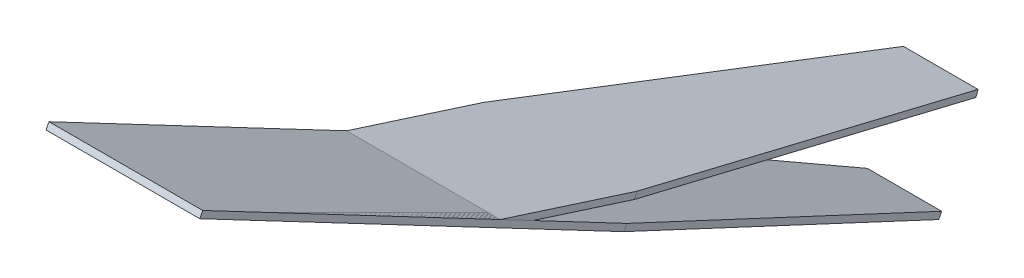
ISO-10303-21;
HEADER;
FILE_DESCRIPTION(('STEP AP214'),'2;1');
FILE_NAME('part.step','',(''),(''),'','','');
FILE_SCHEMA(('AUTOMOTIVE_DESIGN { 1 0 10303 214 1 1 1 1 }'));
ENDSEC;
DATA;
#1=APPLICATION_CONTEXT('core data for automotive mechanical design processes');
#2=APPLICATION_PROTOCOL_DEFINITION('international standard','automotive_design',2000,#1);
#3=PRODUCT_CONTEXT('',#1,'mechanical');
#4=PRODUCT('Part','Part','',(#3));
#5=PRODUCT_RELATED_PRODUCT_CATEGORY('part','',(#4));
#6=PRODUCT_DEFINITION_FORMATION('','',#4);
#7=PRODUCT_DEFINITION_CONTEXT('part definition',#1,'design');
#8=PRODUCT_DEFINITION('design','',#6,#7);
#9=PRODUCT_DEFINITION_SHAPE('','',#8);
#10=(LENGTH_UNIT() NAMED_UNIT(*) SI_UNIT(.MILLI.,.METRE.));
#11=(NAMED_UNIT(*) PLANE_ANGLE_UNIT() SI_UNIT($,.RADIAN.));
#12=(NAMED_UNIT(*) SI_UNIT($,.STERADIAN.) SOLID_ANGLE_UNIT());
#13=UNCERTAINTY_MEASURE_WITH_UNIT(LENGTH_MEASURE(1.E-05),#10,'distance_accuracy_value','');
#14=(GEOMETRIC_REPRESENTATION_CONTEXT(3) GLOBAL_UNCERTAINTY_ASSIGNED_CONTEXT((#13)) GLOBAL_UNIT_ASSIGNED_CONTEXT((#10,
#11,#12)) REPRESENTATION_CONTEXT('',''));
#15=CARTESIAN_POINT('',(0.,0.,0.));
#16=DIRECTION('',(0.,0.,1.));
#17=DIRECTION('',(1.,0.,0.));
#18=AXIS2_PLACEMENT_3D('',#15,#16,#17);
#19=CARTESIAN_POINT('',(0.,-126.907686258732,-230.347518193351));
#20=DIRECTION('',(1.,0.,0.));
#21=DIRECTION('',(0.,-0.465811684103782,-0.884883876535447));
#22=AXIS2_PLACEMENT_3D('',#19,#20,#21);
#23=PLANE('',#22);
#24=DIRECTION('',(0.,-0.465811684103782,-0.884883876535447));
#25=VECTOR('',#24,1.);
#26=CARTESIAN_POINT('',(0.,-126.907686258732,-230.347518193351));
#27=LINE('',#26,#25);
#28=CARTESIAN_POINT('',(0.,-4.42441938267723,2.32905842051891));
#29=VERTEX_POINT('',#28);
#30=CARTESIAN_POINT('',(0.,-178.708773432246,-328.751977315156));
#31=VERTEX_POINT('',#30);
#32=EDGE_CURVE('E129',#29,#31,#27,.T.);
#33=ORIENTED_EDGE('',*,*,#32,.F.);
#34=DIRECTION('',(0.,-0.884883876535447,0.465811684103782));
#35=VECTOR('',#34,1.);
#36=CARTESIAN_POINT('',(0.,-4.42441938267723,2.32905842051891));
#37=LINE('',#36,#35);
#38=CARTESIAN_POINT('',(0.,0.,0.));
#39=VERTEX_POINT('',#38);
#40=EDGE_CURVE('E168',#39,#29,#37,.T.);
#41=ORIENTED_EDGE('',*,*,#40,.F.);
#42=DIRECTION('',(0.,0.465811684103782,0.884883876535447));
#43=VECTOR('',#42,1.);
#44=CARTESIAN_POINT('',(0.,-122.483266876055,-232.67657661387));
#45=LINE('',#44,#43);
#46=CARTESIAN_POINT('',(0.,-174.284354049569,-331.081035735675));
#47=VERTEX_POINT('',#46);
#48=EDGE_CURVE('E107',#39,#47,#45,.F.);
#49=ORIENTED_EDGE('',*,*,#48,.T.);
#50=DIRECTION('',(0.,-0.884883876535447,0.465811684103782));
#51=VECTOR('',#50,1.);
#52=CARTESIAN_POINT('',(0.,-178.708773432246,-328.751977315156));
#53=LINE('',#52,#51);
#54=EDGE_CURVE('E13',#47,#31,#53,.T.);
#55=ORIENTED_EDGE('',*,*,#54,.T.);
#56=EDGE_LOOP('',(#33,#41,#49,#55));
#57=FACE_BOUND('',#56,.T.);
#58=ADVANCED_FACE('F58',(#57),#23,.F.);
#59=CARTESIAN_POINT('',(-9.74802299306868,-132.898330966599,-241.727706996992));
#60=DIRECTION('',(0.995123490809034,0.0459462205000749,0.0872822024344077));
#61=DIRECTION('',(0.0986368999920538,-0.46354014914499,-0.880568732178584));
#62=AXIS2_PLACEMENT_3D('',#59,#60,#61);
#63=PLANE('',#62);
#64=ORIENTED_EDGE('',*,*,#54,.F.);
#65=DIRECTION('',(0.0986368999920538,-0.46354014914499,-0.880568732178584));
#66=VECTOR('',#65,1.);
#67=CARTESIAN_POINT('',(-9.74802299306868,-128.473911583921,-244.056765417511));
#68=LINE('',#67,#66);
#69=CARTESIAN_POINT('',(31.,-319.967608740788,-607.82970382779));
#70=VERTEX_POINT('',#69);
#71=EDGE_CURVE('E121',#47,#70,#68,.T.);
#72=ORIENTED_EDGE('',*,*,#71,.T.);
#73=DIRECTION('',(0.,-0.884883876535447,0.465811684103782));
#74=VECTOR('',#73,1.);
#75=CARTESIAN_POINT('',(31.,-324.392028123466,-605.500645407271));
#76=LINE('',#75,#74);
#77=CARTESIAN_POINT('',(31.,-324.392028123466,-605.500645407271));
#78=VERTEX_POINT('',#77);
#79=EDGE_CURVE('E68',#70,#78,#76,.T.);
#80=ORIENTED_EDGE('',*,*,#79,.T.);
#81=DIRECTION('',(0.0986368999920538,-0.46354014914499,-0.880568732178584));
#82=VECTOR('',#81,1.);
#83=CARTESIAN_POINT('',(-9.74802299306868,-132.898330966599,-241.727706996992));
#84=LINE('',#83,#82);
#85=EDGE_CURVE('E120',#31,#78,#84,.T.);
#86=ORIENTED_EDGE('',*,*,#85,.F.);
#87=EDGE_LOOP('',(#64,#72,#80,#86));
#88=FACE_BOUND('',#87,.T.);
#89=ADVANCED_FACE('F119',(#88),#63,.F.);
#90=CARTESIAN_POINT('',(120.,-324.392028123465,-605.500645407271));
#91=DIRECTION('',(0.,-0.465811684103782,-0.884883876535447));
#92=DIRECTION('',(-1.,0.,0.));
#93=AXIS2_PLACEMENT_3D('',#90,#91,#92);
#94=PLANE('',#93);
#95=ORIENTED_EDGE('',*,*,#79,.F.);
#96=DIRECTION('',(1.,0.,0.));
#97=VECTOR('',#96,1.);
#98=CARTESIAN_POINT('',(120.,-319.967608740788,-607.82970382779));
#99=LINE('',#98,#97);
#100=CARTESIAN_POINT('',(89.,-319.967608740788,-607.82970382779));
#101=VERTEX_POINT('',#100);
#102=EDGE_CURVE('E151',#101,#70,#99,.F.);
#103=ORIENTED_EDGE('',*,*,#102,.F.);
#104=DIRECTION('',(0.,-0.884883876535447,0.465811684103782));
#105=VECTOR('',#104,1.);
#106=CARTESIAN_POINT('',(89.,-324.392028123467,-605.50064540727));
#107=LINE('',#106,#105);
#108=CARTESIAN_POINT('',(89.,-324.392028123467,-605.50064540727));
#109=VERTEX_POINT('',#108);
#110=EDGE_CURVE('E123',#101,#109,#107,.T.);
#111=ORIENTED_EDGE('',*,*,#110,.T.);
#112=DIRECTION('',(-1.,0.,0.));
#113=VECTOR('',#112,1.);
#114=CARTESIAN_POINT('',(120.,-324.392028123465,-605.500645407271));
#115=LINE('',#114,#113);
#116=EDGE_CURVE('E127',#109,#78,#115,.T.);
#117=ORIENTED_EDGE('',*,*,#116,.T.);
#118=EDGE_LOOP('',(#95,#103,#111,#117));
#119=FACE_BOUND('',#118,.T.);
#120=ADVANCED_FACE('F132',(#119),#94,.T.);
#121=CARTESIAN_POINT('',(130.915531557874,-127.411671366577,-231.304918600349));
#122=DIRECTION('',(-0.995123490809034,0.0459462205000748,0.0872822024344076));
#123=DIRECTION('',(0.0986368999920536,0.46354014914499,0.880568732178584));
#124=AXIS2_PLACEMENT_3D('',#121,#122,#123);
#125=PLANE('',#124);
#126=ORIENTED_EDGE('',*,*,#110,.F.);
#127=DIRECTION('',(0.0986368999920536,0.46354014914499,0.880568732178584));
#128=VECTOR('',#127,1.);
#129=CARTESIAN_POINT('',(130.915531557874,-122.987251983899,-233.633977020868));
#130=LINE('',#129,#128);
#131=CARTESIAN_POINT('',(120.,-174.284354049569,-331.081035735675));
#132=VERTEX_POINT('',#131);
#133=EDGE_CURVE('E148',#101,#132,#130,.T.);
#134=ORIENTED_EDGE('',*,*,#133,.T.);
#135=DIRECTION('',(0.,-0.884883876535447,0.465811684103782));
#136=VECTOR('',#135,1.);
#137=CARTESIAN_POINT('',(120.,-178.708773432246,-328.751977315156));
#138=LINE('',#137,#136);
#139=CARTESIAN_POINT('',(120.,-178.708773432246,-328.751977315156));
#140=VERTEX_POINT('',#139);
#141=EDGE_CURVE('E76',#132,#140,#138,.T.);
#142=ORIENTED_EDGE('',*,*,#141,.T.);
#143=DIRECTION('',(0.0986368999920536,0.46354014914499,0.880568732178584));
#144=VECTOR('',#143,1.);
#145=CARTESIAN_POINT('',(130.915531557874,-127.411671366577,-231.304918600349));
#146=LINE('',#145,#144);
#147=EDGE_CURVE('E134',#109,#140,#146,.T.);
#148=ORIENTED_EDGE('',*,*,#147,.F.);
#149=EDGE_LOOP('',(#126,#134,#142,#148));
#150=FACE_BOUND('',#149,.T.);
#151=ADVANCED_FACE('F183',(#150),#125,.F.);
#152=CARTESIAN_POINT('',(120.,-126.907686258732,-230.347518193351));
#153=DIRECTION('',(1.,0.,0.));
#154=DIRECTION('',(0.,-0.465811684103782,-0.884883876535447));
#155=AXIS2_PLACEMENT_3D('',#152,#153,#154);
#156=PLANE('',#155);
#157=ORIENTED_EDGE('',*,*,#141,.F.);
#158=DIRECTION('',(0.,0.465811684103782,0.884883876535447));
#159=VECTOR('',#158,1.);
#160=CARTESIAN_POINT('',(120.,-122.483266876055,-232.67657661387));
#161=LINE('',#160,#159);
#162=CARTESIAN_POINT('',(120.,0.,0.));
#163=VERTEX_POINT('',#162);
#164=EDGE_CURVE('E144',#163,#132,#161,.F.);
#165=ORIENTED_EDGE('',*,*,#164,.F.);
#166=DIRECTION('',(0.,-0.884883876535447,0.465811684103782));
#167=VECTOR('',#166,1.);
#168=CARTESIAN_POINT('',(120.,-4.42441938267723,2.32905842051891));
#169=LINE('',#168,#167);
#170=CARTESIAN_POINT('',(120.,-4.42441938267723,2.32905842051891));
#171=VERTEX_POINT('',#170);
#172=EDGE_CURVE('E158',#163,#171,#169,.T.);
#173=ORIENTED_EDGE('',*,*,#172,.T.);
#174=DIRECTION('',(0.,-0.465811684103782,-0.884883876535447));
#175=VECTOR('',#174,1.);
#176=CARTESIAN_POINT('',(120.,-126.907686258732,-230.347518193351));
#177=LINE('',#176,#175);
#178=EDGE_CURVE('E137',#171,#140,#177,.T.);
#179=ORIENTED_EDGE('',*,*,#178,.T.);
#180=EDGE_LOOP('',(#157,#165,#173,#179));
#181=FACE_BOUND('',#180,.T.);
#182=ADVANCED_FACE('F180',(#181),#156,.T.);
#183=CARTESIAN_POINT('',(120.,-4.42441938267723,2.32905842051891));
#184=DIRECTION('',(0.,0.884883876535447,-0.465811684103782));
#185=DIRECTION('',(0.,0.465811684103782,0.884883876535447));
#186=AXIS2_PLACEMENT_3D('',#183,#184,#185);
#187=PLANE('',#186);
#188=ORIENTED_EDGE('',*,*,#178,.F.);
#189=DIRECTION('',(-1.,0.,0.));
#190=VECTOR('',#189,1.);
#191=CARTESIAN_POINT('',(120.,-4.42441938267723,2.32905842051891));
#192=LINE('',#191,#190);
#193=EDGE_CURVE('E172',#171,#29,#192,.T.);
#194=ORIENTED_EDGE('',*,*,#193,.T.);
#195=ORIENTED_EDGE('',*,*,#32,.T.);
#196=ORIENTED_EDGE('',*,*,#85,.T.);
#197=ORIENTED_EDGE('',*,*,#116,.F.);
#198=ORIENTED_EDGE('',*,*,#147,.T.);
#199=EDGE_LOOP('',(#188,#194,#195,#196,#197,#198));
#200=FACE_BOUND('',#199,.T.);
#201=ADVANCED_FACE('F60',(#200),#187,.F.);
#202=CARTESIAN_POINT('',(120.,-122.483266876055,-232.67657661387));
#203=DIRECTION('',(0.,0.884883876535447,-0.465811684103782));
#204=DIRECTION('',(0.,0.465811684103782,0.884883876535447));
#205=AXIS2_PLACEMENT_3D('',#202,#203,#204);
#206=PLANE('',#205);
#207=ORIENTED_EDGE('',*,*,#164,.T.);
#208=ORIENTED_EDGE('',*,*,#133,.F.);
#209=ORIENTED_EDGE('',*,*,#102,.T.);
#210=ORIENTED_EDGE('',*,*,#71,.F.);
#211=ORIENTED_EDGE('',*,*,#48,.F.);
#212=DIRECTION('',(1.,0.,0.));
#213=VECTOR('',#212,1.);
#214=CARTESIAN_POINT('',(120.,0.,0.));
#215=LINE('',#214,#213);
#216=EDGE_CURVE('E164',#163,#39,#215,.F.);
#217=ORIENTED_EDGE('',*,*,#216,.F.);
#218=EDGE_LOOP('',(#207,#208,#209,#210,#211,#217));
#219=FACE_BOUND('',#218,.T.);
#220=ADVANCED_FACE('F185',(#219),#206,.T.);
#221=CARTESIAN_POINT('',(120.,-4.42441938267723,2.32905842051891));
#222=DIRECTION('',(0.,-0.465811684103782,-0.884883876535447));
#223=DIRECTION('',(-1.,0.,0.));
#224=AXIS2_PLACEMENT_3D('',#221,#222,#223);
#225=PLANE('',#224);
#226=ORIENTED_EDGE('',*,*,#172,.F.);
#227=ORIENTED_EDGE('',*,*,#216,.T.);
#228=ORIENTED_EDGE('',*,*,#40,.T.);
#229=ORIENTED_EDGE('',*,*,#193,.F.);
#230=EDGE_LOOP('',(#226,#227,#228,#229));
#231=FACE_BOUND('',#230,.T.);
#232=ADVANCED_FACE('F182',(#231),#225,.F.);
#233=CLOSED_SHELL('',(#58,#89,#120,#151,#182,#201,#220,#232));
#234=MANIFOLD_SOLID_BREP('B2',#233);
#235=CARTESIAN_POINT('',(120.,-127.041864455125,-230.765484002611));
#236=DIRECTION('',(0.,0.952327852208191,-0.305076485341848));
#237=DIRECTION('',(0.,0.305076485341848,0.952327852208191));
#238=AXIS2_PLACEMENT_3D('',#235,#236,#237);
#239=PLANE('',#238);
#240=DIRECTION('',(0.,-0.305076485341848,-0.952327852208191));
#241=VECTOR('',#240,1.);
#242=CARTESIAN_POINT('',(0.,-127.041864455125,-230.765484002611));
#243=LINE('',#242,#241);
#244=CARTESIAN_POINT('',(0.,-126.908410785246,-230.34889454747));
#245=VERTEX_POINT('',#244);
#246=CARTESIAN_POINT('',(0.,-160.968221717261,-336.670122665583));
#247=VERTEX_POINT('',#246);
#248=EDGE_CURVE('E410',#245,#247,#243,.T.);
#249=ORIENTED_EDGE('',*,*,#248,.T.);
#250=DIRECTION('',(0.0986368999920538,-0.30358877705713,-0.947683816684085));
#251=VECTOR('',#250,1.);
#252=CARTESIAN_POINT('',(-9.74802299306868,-130.965348761715,-243.01304670375));
#253=LINE('',#252,#251);
#254=CARTESIAN_POINT('',(31.,-256.38131853528,-634.511988332218));
#255=VERTEX_POINT('',#254);
#256=EDGE_CURVE('E353',#247,#255,#253,.T.);
#257=ORIENTED_EDGE('',*,*,#256,.T.);
#258=DIRECTION('',(-1.,0.,0.));
#259=VECTOR('',#258,1.);
#260=CARTESIAN_POINT('',(120.,-256.381318535279,-634.511988332218));
#261=LINE('',#260,#259);
#262=CARTESIAN_POINT('',(89.,-256.381318535281,-634.511988332218));
#263=VERTEX_POINT('',#262);
#264=EDGE_CURVE('E407',#263,#255,#261,.T.);
#265=ORIENTED_EDGE('',*,*,#264,.F.);
#266=DIRECTION('',(0.0986368999920536,0.30358877705713,0.947683816684085));
#267=VECTOR('',#266,1.);
#268=CARTESIAN_POINT('',(130.915531557874,-127.371942060759,-231.795855441707));
#269=LINE('',#268,#267);
#270=CARTESIAN_POINT('',(120.,-160.968221717261,-336.670122665583));
#271=VERTEX_POINT('',#270);
#272=EDGE_CURVE('E455',#263,#271,#269,.T.);
#273=ORIENTED_EDGE('',*,*,#272,.T.);
#274=DIRECTION('',(0.,-0.305076485341848,-0.952327852208191));
#275=VECTOR('',#274,1.);
#276=CARTESIAN_POINT('',(120.,-127.041864455125,-230.765484002611));
#277=LINE('',#276,#275);
#278=CARTESIAN_POINT('',(120.,-126.908410785246,-230.34889454747));
#279=VERTEX_POINT('',#278);
#280=EDGE_CURVE('E440',#279,#271,#277,.T.);
#281=ORIENTED_EDGE('',*,*,#280,.F.);
#282=DIRECTION('',(-1.,0.,0.));
#283=VECTOR('',#282,1.);
#284=CARTESIAN_POINT('',(120.,-126.908410785246,-230.34889454747));
#285=LINE('',#284,#283);
#286=EDGE_CURVE('E433',#279,#245,#285,.T.);
#287=ORIENTED_EDGE('',*,*,#286,.T.);
#288=EDGE_LOOP('',(#249,#257,#265,#273,#281,#287));
#289=FACE_BOUND('',#288,.T.);
#290=ADVANCED_FACE('F331',(#289),#239,.F.);
#291=CARTESIAN_POINT('',(120.,-251.619679274238,-636.037370758928));
#292=DIRECTION('',(0.,-0.305076485341855,-0.952327852208188));
#293=DIRECTION('',(0.,0.952327852208188,-0.305076485341855));
#294=AXIS2_PLACEMENT_3D('',#291,#292,#293);
#295=PLANE('',#294);
#296=DIRECTION('',(0.0174749075352037,-0.9521824337879,0.305029900816933));
#297=VECTOR('',#296,1.);
#298=CARTESIAN_POINT('',(30.9398169472378,-253.102031046267,-635.562502080455));
#299=LINE('',#298,#297);
#300=CARTESIAN_POINT('',(30.9126121183819,-251.619679274238,-636.037370758928));
#301=VERTEX_POINT('',#300);
#302=EDGE_CURVE('E393',#301,#255,#299,.T.);
#303=ORIENTED_EDGE('',*,*,#302,.F.);
#304=DIRECTION('',(-1.,0.,0.));
#305=VECTOR('',#304,1.);
#306=CARTESIAN_POINT('',(120.,-251.619679274238,-636.037370758928));
#307=LINE('',#306,#305);
#308=CARTESIAN_POINT('',(89.0873878816181,-251.619679274238,-636.037370758928));
#309=VERTEX_POINT('',#308);
#310=EDGE_CURVE('E417',#309,#301,#307,.T.);
#311=ORIENTED_EDGE('',*,*,#310,.F.);
#312=DIRECTION('',(0.0174749075352036,0.9521824337879,-0.305029900816933));
#313=VECTOR('',#312,1.);
#314=CARTESIAN_POINT('',(89.0968277399658,-251.105315047816,-636.202146397925));
#315=LINE('',#314,#313);
#316=EDGE_CURVE('E415',#263,#309,#315,.T.);
#317=ORIENTED_EDGE('',*,*,#316,.F.);
#318=ORIENTED_EDGE('',*,*,#264,.T.);
#319=EDGE_LOOP('',(#303,#311,#317,#318));
#320=FACE_BOUND('',#319,.T.);
#321=ADVANCED_FACE('F414',(#320),#295,.T.);
#322=CARTESIAN_POINT('',(120.,-122.280225194084,-232.29086642932));
#323=DIRECTION('',(0.,0.952327852208191,-0.305076485341847));
#324=DIRECTION('',(0.,0.305076485341848,0.952327852208191));
#325=AXIS2_PLACEMENT_3D('',#322,#323,#324);
#326=PLANE('',#325);
#327=DIRECTION('',(0.0986368999920538,-0.30358877705713,-0.947683816684085));
#328=VECTOR('',#327,1.);
#329=CARTESIAN_POINT('',(-9.83456065718469,-126.206326335669,-244.546597851977));
#330=LINE('',#329,#328);
#331=CARTESIAN_POINT('',(0.,-156.475548533947,-339.035110566415));
#332=VERTEX_POINT('',#331);
#333=EDGE_CURVE('E396',#332,#301,#330,.T.);
#334=ORIENTED_EDGE('',*,*,#333,.F.);
#335=DIRECTION('',(0.,-0.305076485341848,-0.952327852208191));
#336=VECTOR('',#335,1.);
#337=CARTESIAN_POINT('',(0.,-122.280225194084,-232.29086642932));
#338=LINE('',#337,#336);
#339=CARTESIAN_POINT('',(0.,-122.280225194084,-232.29086642932));
#340=VERTEX_POINT('',#339);
#341=EDGE_CURVE('E449',#340,#332,#338,.T.);
#342=ORIENTED_EDGE('',*,*,#341,.F.);
#343=DIRECTION('',(-1.,0.,0.));
#344=VECTOR('',#343,1.);
#345=CARTESIAN_POINT('',(120.,-122.280225194084,-232.29086642932));
#346=LINE('',#345,#344);
#347=CARTESIAN_POINT('',(120.,-122.280225194084,-232.29086642932));
#348=VERTEX_POINT('',#347);
#349=EDGE_CURVE('E422',#348,#340,#346,.T.);
#350=ORIENTED_EDGE('',*,*,#349,.F.);
#351=DIRECTION('',(0.,-0.305076485341848,-0.952327852208191));
#352=VECTOR('',#351,1.);
#353=CARTESIAN_POINT('',(120.,-122.280225194084,-232.29086642932));
#354=LINE('',#353,#352);
#355=CARTESIAN_POINT('',(120.,-156.475548533947,-339.035110566414));
#356=VERTEX_POINT('',#355);
#357=EDGE_CURVE('E466',#348,#356,#354,.T.);
#358=ORIENTED_EDGE('',*,*,#357,.T.);
#359=DIRECTION('',(0.0986368999920536,0.30358877705713,0.947683816684085));
#360=VECTOR('',#359,1.);
#361=CARTESIAN_POINT('',(131.00206922199,-122.612919634713,-233.329406589934));
#362=LINE('',#361,#360);
#363=EDGE_CURVE('E346',#309,#356,#362,.T.);
#364=ORIENTED_EDGE('',*,*,#363,.F.);
#365=ORIENTED_EDGE('',*,*,#310,.T.);
#366=EDGE_LOOP('',(#334,#342,#350,#358,#364,#365));
#367=FACE_BOUND('',#366,.T.);
#368=ADVANCED_FACE('F489',(#367),#326,.T.);
#369=CARTESIAN_POINT('',(120.,0.,0.));
#370=DIRECTION('',(0.,0.884883876535446,-0.465811684103782));
#371=DIRECTION('',(0.,0.465811684103782,0.884883876535446));
#372=AXIS2_PLACEMENT_3D('',#369,#370,#371);
#373=PLANE('',#372);
#374=DIRECTION('',(0.,-0.465811684103782,-0.884883876535446));
#375=VECTOR('',#374,1.);
#376=CARTESIAN_POINT('',(0.,0.,0.));
#377=LINE('',#376,#375);
#378=CARTESIAN_POINT('',(0.,0.,0.));
#379=VERTEX_POINT('',#378);
#380=EDGE_CURVE('E445',#379,#340,#377,.T.);
#381=ORIENTED_EDGE('',*,*,#380,.F.);
#382=DIRECTION('',(-1.,0.,0.));
#383=VECTOR('',#382,1.);
#384=CARTESIAN_POINT('',(120.,0.,0.));
#385=LINE('',#384,#383);
#386=CARTESIAN_POINT('',(120.,0.,0.));
#387=VERTEX_POINT('',#386);
#388=EDGE_CURVE('E427',#387,#379,#385,.T.);
#389=ORIENTED_EDGE('',*,*,#388,.F.);
#390=DIRECTION('',(0.,-0.465811684103782,-0.884883876535446));
#391=VECTOR('',#390,1.);
#392=CARTESIAN_POINT('',(120.,0.,0.));
#393=LINE('',#392,#391);
#394=EDGE_CURVE('E462',#387,#348,#393,.T.);
#395=ORIENTED_EDGE('',*,*,#394,.T.);
#396=ORIENTED_EDGE('',*,*,#349,.T.);
#397=EDGE_LOOP('',(#381,#389,#395,#396));
#398=FACE_BOUND('',#397,.T.);
#399=ADVANCED_FACE('F498',(#398),#373,.T.);
#400=CARTESIAN_POINT('',(120.,-4.42441938267723,2.32905842051891));
#401=DIRECTION('',(0.,0.465811684103782,0.884883876535446));
#402=DIRECTION('',(0.,-0.884883876535446,0.465811684103782));
#403=AXIS2_PLACEMENT_3D('',#400,#401,#402);
#404=PLANE('',#403);
#405=DIRECTION('',(0.,0.884883876535446,-0.465811684103782));
#406=VECTOR('',#405,1.);
#407=CARTESIAN_POINT('',(0.,-4.42441938267723,2.32905842051891));
#408=LINE('',#407,#406);
#409=CARTESIAN_POINT('',(0.,-4.42441938267723,2.32905842051891));
#410=VERTEX_POINT('',#409);
#411=EDGE_CURVE('E441',#410,#379,#408,.T.);
#412=ORIENTED_EDGE('',*,*,#411,.F.);
#413=DIRECTION('',(-1.,0.,0.));
#414=VECTOR('',#413,1.);
#415=CARTESIAN_POINT('',(120.,-4.42441938267723,2.32905842051891));
#416=LINE('',#415,#414);
#417=CARTESIAN_POINT('',(120.,-4.42441938267723,2.32905842051891));
#418=VERTEX_POINT('',#417);
#419=EDGE_CURVE('E430',#418,#410,#416,.T.);
#420=ORIENTED_EDGE('',*,*,#419,.F.);
#421=DIRECTION('',(0.,0.884883876535446,-0.465811684103782));
#422=VECTOR('',#421,1.);
#423=CARTESIAN_POINT('',(120.,-4.42441938267723,2.32905842051891));
#424=LINE('',#423,#422);
#425=EDGE_CURVE('E458',#418,#387,#424,.T.);
#426=ORIENTED_EDGE('',*,*,#425,.T.);
#427=ORIENTED_EDGE('',*,*,#388,.T.);
#428=EDGE_LOOP('',(#412,#420,#426,#427));
#429=FACE_BOUND('',#428,.T.);
#430=ADVANCED_FACE('F501',(#429),#404,.T.);
#431=CARTESIAN_POINT('',(120.,-4.42441938267723,2.32905842051891));
#432=DIRECTION('',(0.,0.884883876535446,-0.465811684103782));
#433=DIRECTION('',(0.,0.465811684103782,0.884883876535446));
#434=AXIS2_PLACEMENT_3D('',#431,#432,#433);
#435=PLANE('',#434);
#436=DIRECTION('',(0.,-0.465811684103782,-0.884883876535446));
#437=VECTOR('',#436,1.);
#438=CARTESIAN_POINT('',(0.,-4.42441938267723,2.32905842051891));
#439=LINE('',#438,#437);
#440=EDGE_CURVE('E437',#410,#245,#439,.T.);
#441=ORIENTED_EDGE('',*,*,#440,.T.);
#442=ORIENTED_EDGE('',*,*,#286,.F.);
#443=DIRECTION('',(0.,-0.465811684103782,-0.884883876535446));
#444=VECTOR('',#443,1.);
#445=CARTESIAN_POINT('',(120.,-4.42441938267723,2.32905842051891));
#446=LINE('',#445,#444);
#447=EDGE_CURVE('E436',#418,#279,#446,.T.);
#448=ORIENTED_EDGE('',*,*,#447,.F.);
#449=ORIENTED_EDGE('',*,*,#419,.T.);
#450=EDGE_LOOP('',(#441,#442,#448,#449));
#451=FACE_BOUND('',#450,.T.);
#452=ADVANCED_FACE('F506',(#451),#435,.F.);
#453=CARTESIAN_POINT('',(120.,0.,0.));
#454=DIRECTION('',(-1.,0.,0.));
#455=DIRECTION('',(0.,0.,1.));
#456=AXIS2_PLACEMENT_3D('',#453,#454,#455);
#457=PLANE('',#456);
#458=ORIENTED_EDGE('',*,*,#280,.T.);
#459=DIRECTION('',(0.,0.884883876535446,-0.465811684103781));
#460=VECTOR('',#459,1.);
#461=CARTESIAN_POINT('',(120.,-173.698774207424,-329.968633066482));
#462=LINE('',#461,#460);
#463=EDGE_CURVE('E56',#271,#356,#462,.T.);
#464=ORIENTED_EDGE('',*,*,#463,.T.);
#465=ORIENTED_EDGE('',*,*,#357,.F.);
#466=ORIENTED_EDGE('',*,*,#394,.F.);
#467=ORIENTED_EDGE('',*,*,#425,.F.);
#468=ORIENTED_EDGE('',*,*,#447,.T.);
#469=EDGE_LOOP('',(#458,#464,#465,#466,#467,#468));
#470=FACE_BOUND('',#469,.T.);
#471=ADVANCED_FACE('F494',(#470),#457,.F.);
#472=CARTESIAN_POINT('',(0.,0.,0.));
#473=DIRECTION('',(-1.,0.,0.));
#474=DIRECTION('',(0.,0.,1.));
#475=AXIS2_PLACEMENT_3D('',#472,#473,#474);
#476=PLANE('',#475);
#477=DIRECTION('',(0.,0.884883876535446,-0.465811684103782));
#478=VECTOR('',#477,1.);
#479=CARTESIAN_POINT('',(0.,-173.698774207424,-329.968633066482));
#480=LINE('',#479,#478);
#481=EDGE_CURVE('E339',#247,#332,#480,.T.);
#482=ORIENTED_EDGE('',*,*,#481,.F.);
#483=ORIENTED_EDGE('',*,*,#248,.F.);
#484=ORIENTED_EDGE('',*,*,#440,.F.);
#485=ORIENTED_EDGE('',*,*,#411,.T.);
#486=ORIENTED_EDGE('',*,*,#380,.T.);
#487=ORIENTED_EDGE('',*,*,#341,.T.);
#488=EDGE_LOOP('',(#482,#483,#484,#485,#486,#487));
#489=FACE_BOUND('',#488,.T.);
#490=ADVANCED_FACE('F509',(#489),#476,.T.);
#491=CARTESIAN_POINT('',(31.,-55.0010068716362,-740.520589696568));
#492=DIRECTION('',(0.994973015640291,0.0466479601871749,0.0886152693278125));
#493=DIRECTION('',(0.0887118418043117,0.,-0.996057332247339));
#494=AXIS2_PLACEMENT_3D('',#491,#492,#493);
#495=PLANE('',#494);
#496=ORIENTED_EDGE('',*,*,#481,.T.);
#497=ORIENTED_EDGE('',*,*,#333,.T.);
#498=ORIENTED_EDGE('',*,*,#302,.T.);
#499=ORIENTED_EDGE('',*,*,#256,.F.);
#500=EDGE_LOOP('',(#496,#497,#498,#499));
#501=FACE_BOUND('',#500,.T.);
#502=ADVANCED_FACE('F394',(#501),#495,.F.);
#503=CARTESIAN_POINT('',(89.,-55.0010068716362,-740.520589696568));
#504=DIRECTION('',(-0.994973015640291,0.0466479601871748,0.0886152693278123));
#505=DIRECTION('',(0.0887118418043115,0.,0.996057332247339));
#506=AXIS2_PLACEMENT_3D('',#503,#504,#505);
#507=PLANE('',#506);
#508=ORIENTED_EDGE('',*,*,#316,.T.);
#509=ORIENTED_EDGE('',*,*,#363,.T.);
#510=ORIENTED_EDGE('',*,*,#463,.F.);
#511=ORIENTED_EDGE('',*,*,#272,.F.);
#512=EDGE_LOOP('',(#508,#509,#510,#511));
#513=FACE_BOUND('',#512,.T.);
#514=ADVANCED_FACE('F487',(#513),#507,.F.);
#515=CLOSED_SHELL('',(#290,#321,#368,#399,#430,#452,#471,#490,#502,#514));
#516=MANIFOLD_SOLID_BREP('B7_NOT_SHOWN',#515);
#517=ADVANCED_BREP_SHAPE_REPRESENTATION('',(#18,#234,#516),#14);
#518=SHAPE_DEFINITION_REPRESENTATION(#9,#517);
ENDSEC;
END-ISO-10303-21;
